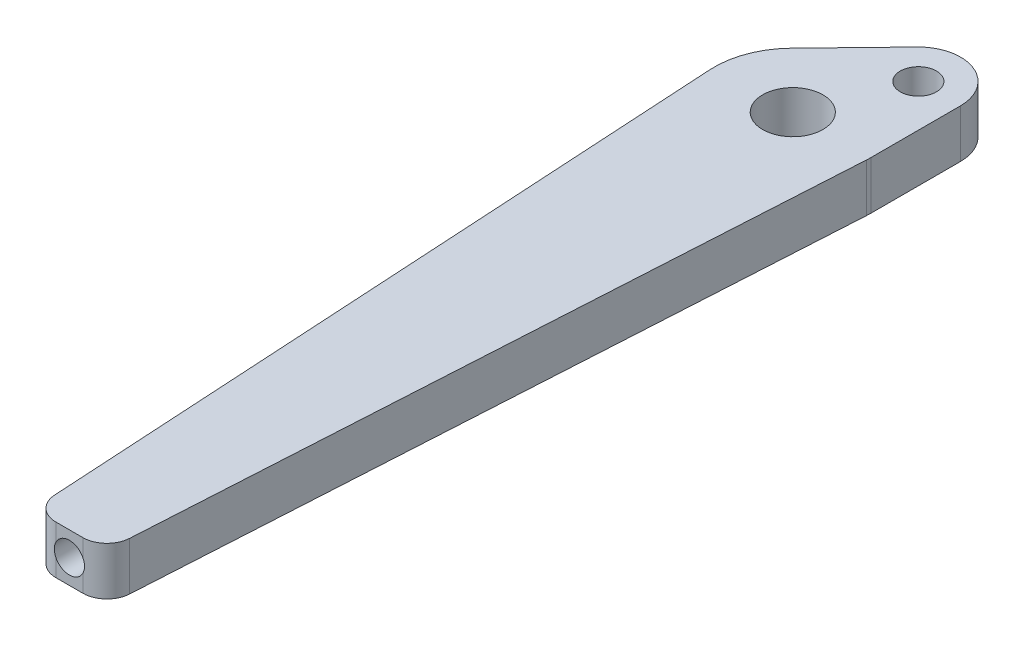
ISO-10303-21;
HEADER;
FILE_DESCRIPTION(('STEP AP214'),'2;1');
FILE_NAME('part.step','',(''),(''),'','','');
FILE_SCHEMA(('AUTOMOTIVE_DESIGN { 1 0 10303 214 1 1 1 1 }'));
ENDSEC;
DATA;
#1=APPLICATION_CONTEXT('core data for automotive mechanical design processes');
#2=APPLICATION_PROTOCOL_DEFINITION('international standard','automotive_design',2000,#1);
#3=PRODUCT_CONTEXT('',#1,'mechanical');
#4=PRODUCT('Part','Part','',(#3));
#5=PRODUCT_RELATED_PRODUCT_CATEGORY('part','',(#4));
#6=PRODUCT_DEFINITION_FORMATION('','',#4);
#7=PRODUCT_DEFINITION_CONTEXT('part definition',#1,'design');
#8=PRODUCT_DEFINITION('design','',#6,#7);
#9=PRODUCT_DEFINITION_SHAPE('','',#8);
#10=(LENGTH_UNIT() NAMED_UNIT(*) SI_UNIT(.MILLI.,.METRE.));
#11=(NAMED_UNIT(*) PLANE_ANGLE_UNIT() SI_UNIT($,.RADIAN.));
#12=(NAMED_UNIT(*) SI_UNIT($,.STERADIAN.) SOLID_ANGLE_UNIT());
#13=UNCERTAINTY_MEASURE_WITH_UNIT(LENGTH_MEASURE(1.E-05),#10,'distance_accuracy_value','');
#14=(GEOMETRIC_REPRESENTATION_CONTEXT(3) GLOBAL_UNCERTAINTY_ASSIGNED_CONTEXT((#13)) GLOBAL_UNIT_ASSIGNED_CONTEXT((#10,
#11,#12)) REPRESENTATION_CONTEXT('',''));
#15=CARTESIAN_POINT('',(0.,0.,0.));
#16=DIRECTION('',(0.,0.,1.));
#17=DIRECTION('',(1.,0.,0.));
#18=AXIS2_PLACEMENT_3D('',#15,#16,#17);
#19=CARTESIAN_POINT('',(-3.80999999999999,5.08,76.2));
#20=DIRECTION('',(0.,0.,-1.));
#21=DIRECTION('',(-1.,0.,0.));
#22=AXIS2_PLACEMENT_3D('',#19,#20,#21);
#23=PLANE('',#22);
#24=DIRECTION('',(1.,0.,0.));
#25=VECTOR('',#24,1.);
#26=CARTESIAN_POINT('',(-3.80999999999999,5.08,76.2));
#27=LINE('',#26,#25);
#28=CARTESIAN_POINT('',(-1.41429209457838,5.08,76.2));
#29=VERTEX_POINT('',#28);
#30=CARTESIAN_POINT('',(1.41429209457839,5.08,76.2));
#31=VERTEX_POINT('',#30);
#32=EDGE_CURVE('E170',#29,#31,#27,.T.);
#33=ORIENTED_EDGE('',*,*,#32,.F.);
#34=DIRECTION('',(0.,-1.,0.));
#35=VECTOR('',#34,1.);
#36=CARTESIAN_POINT('',(-1.41429209457838,5.08,76.2));
#37=LINE('',#36,#35);
#38=CARTESIAN_POINT('',(-1.41429209457838,3.26106457492591,76.2));
#39=VERTEX_POINT('',#38);
#40=EDGE_CURVE('E222',#29,#39,#37,.T.);
#41=ORIENTED_EDGE('',*,*,#40,.T.);
#42=CARTESIAN_POINT('',(0.,2.54,76.2));
#43=DIRECTION('',(0.,0.,1.));
#44=DIRECTION('',(1.,0.,0.));
#45=AXIS2_PLACEMENT_3D('',#42,#43,#44);
#46=CIRCLE('',#45,1.5875);
#47=CARTESIAN_POINT('',(1.41429209457839,3.26106457492591,76.2));
#48=VERTEX_POINT('',#47);
#49=EDGE_CURVE('E146',#48,#39,#46,.T.);
#50=ORIENTED_EDGE('',*,*,#49,.F.);
#51=DIRECTION('',(0.,-1.,0.));
#52=VECTOR('',#51,1.);
#53=CARTESIAN_POINT('',(1.41429209457839,5.08,76.2));
#54=LINE('',#53,#52);
#55=EDGE_CURVE('E216',#48,#31,#54,.F.);
#56=ORIENTED_EDGE('',*,*,#55,.T.);
#57=EDGE_LOOP('',(#33,#41,#50,#56));
#58=FACE_BOUND('',#57,.T.);
#59=ADVANCED_FACE('F42',(#58),#23,.F.);
#60=CARTESIAN_POINT('',(0.,5.08,0.));
#61=DIRECTION('',(0.,1.,0.));
#62=DIRECTION('',(0.,0.,1.));
#63=AXIS2_PLACEMENT_3D('',#60,#61,#62);
#64=PLANE('',#63);
#65=CARTESIAN_POINT('',(0.,5.08,0.));
#66=DIRECTION('',(0.,1.,0.));
#67=DIRECTION('',(0.,0.,1.));
#68=AXIS2_PLACEMENT_3D('',#65,#66,#67);
#69=CIRCLE('',#68,3.175);
#70=CARTESIAN_POINT('',(0.,5.08,3.175));
#71=VERTEX_POINT('',#70);
#72=EDGE_CURVE('E158',#71,#71,#69,.T.);
#73=ORIENTED_EDGE('',*,*,#72,.F.);
#74=EDGE_LOOP('',(#73));
#75=FACE_BOUND('',#74,.T.);
#76=DIRECTION('',(0.0584187249361711,0.,0.998292167943249));
#77=VECTOR('',#76,1.);
#78=CARTESIAN_POINT('',(-8.24090184637152,5.08,0.482246574348092));
#79=LINE('',#78,#77);
#80=CARTESIAN_POINT('',(-8.24090184637152,5.08,0.482246574348092));
#81=VERTEX_POINT('',#80);
#82=CARTESIAN_POINT('',(-3.94995420115423,5.08,73.8083835613379));
#83=VERTEX_POINT('',#82);
#84=EDGE_CURVE('E167',#81,#83,#79,.T.);
#85=ORIENTED_EDGE('',*,*,#84,.T.);
#86=CARTESIAN_POINT('',(-1.41429209457838,5.08,73.66));
#87=DIRECTION('',(0.,1.,0.));
#88=DIRECTION('',(0.,0.,1.));
#89=AXIS2_PLACEMENT_3D('',#86,#87,#88);
#90=CIRCLE('',#89,2.54);
#91=EDGE_CURVE('E51',#83,#29,#90,.T.);
#92=ORIENTED_EDGE('',*,*,#91,.T.);
#93=ORIENTED_EDGE('',*,*,#32,.T.);
#94=CARTESIAN_POINT('',(1.41429209457839,5.08,73.66));
#95=DIRECTION('',(0.,1.,0.));
#96=DIRECTION('',(0.,0.,1.));
#97=AXIS2_PLACEMENT_3D('',#94,#95,#96);
#98=CIRCLE('',#97,2.54);
#99=CARTESIAN_POINT('',(3.94995420115425,5.08,73.8083835613379));
#100=VERTEX_POINT('',#99);
#101=EDGE_CURVE('E58',#31,#100,#98,.T.);
#102=ORIENTED_EDGE('',*,*,#101,.T.);
#103=DIRECTION('',(0.0584187249361708,0.,-0.998292167943249));
#104=VECTOR('',#103,1.);
#105=CARTESIAN_POINT('',(8.24090184637152,5.08,0.48224657434809));
#106=LINE('',#105,#104);
#107=CARTESIAN_POINT('',(8.24090184637152,5.08,0.48224657434809));
#108=VERTEX_POINT('',#107);
#109=EDGE_CURVE('E172',#100,#108,#106,.T.);
#110=ORIENTED_EDGE('',*,*,#109,.T.);
#111=CARTESIAN_POINT('',(0.,5.08,0.));
#112=DIRECTION('',(0.,1.,0.));
#113=DIRECTION('',(0.,0.,1.));
#114=AXIS2_PLACEMENT_3D('',#111,#112,#113);
#115=CIRCLE('',#114,8.255);
#116=CARTESIAN_POINT('',(8.255,5.08,0.));
#117=VERTEX_POINT('',#116);
#118=EDGE_CURVE('E174',#108,#117,#115,.T.);
#119=ORIENTED_EDGE('',*,*,#118,.T.);
#120=DIRECTION('',(0.,0.,-1.));
#121=VECTOR('',#120,1.);
#122=CARTESIAN_POINT('',(8.255,5.08,-9.41857207861149));
#123=LINE('',#122,#121);
#124=CARTESIAN_POINT('',(8.255,5.08,-9.41857207861149));
#125=VERTEX_POINT('',#124);
#126=EDGE_CURVE('E176',#117,#125,#123,.T.);
#127=ORIENTED_EDGE('',*,*,#126,.T.);
#128=CARTESIAN_POINT('',(3.81,5.08,-9.41857207861149));
#129=DIRECTION('',(0.,1.,0.));
#130=DIRECTION('',(0.,0.,1.));
#131=AXIS2_PLACEMENT_3D('',#128,#129,#130);
#132=CIRCLE('',#131,4.445);
#133=CARTESIAN_POINT('',(0.615156250000001,5.08,-12.5090410419059));
#134=VERTEX_POINT('',#133);
#135=EDGE_CURVE('E178',#125,#134,#132,.T.);
#136=ORIENTED_EDGE('',*,*,#135,.T.);
#137=DIRECTION('',(-0.695268608165218,0.,0.71875));
#138=VECTOR('',#137,1.);
#139=CARTESIAN_POINT('',(-5.93328125,5.08,-5.73944236040388));
#140=LINE('',#139,#138);
#141=CARTESIAN_POINT('',(-5.93328125,5.08,-5.73944236040388));
#142=VERTEX_POINT('',#141);
#143=EDGE_CURVE('E180',#134,#142,#140,.T.);
#144=ORIENTED_EDGE('',*,*,#143,.T.);
#145=CARTESIAN_POINT('',(0.,5.08,0.));
#146=DIRECTION('',(0.,1.,0.));
#147=DIRECTION('',(0.,0.,1.));
#148=AXIS2_PLACEMENT_3D('',#145,#146,#147);
#149=CIRCLE('',#148,8.255);
#150=EDGE_CURVE('E164',#142,#81,#149,.T.);
#151=ORIENTED_EDGE('',*,*,#150,.T.);
#152=EDGE_LOOP('',(#85,#92,#93,#102,#110,#119,#127,#136,#144,#151));
#153=FACE_BOUND('',#152,.T.);
#154=CARTESIAN_POINT('',(3.81,5.08,-9.41857207861149));
#155=DIRECTION('',(0.,1.,0.));
#156=DIRECTION('',(0.,0.,1.));
#157=AXIS2_PLACEMENT_3D('',#154,#155,#156);
#158=CIRCLE('',#157,1.905);
#159=CARTESIAN_POINT('',(3.81,5.08,-7.51357207861149));
#160=VERTEX_POINT('',#159);
#161=EDGE_CURVE('E149',#160,#160,#158,.T.);
#162=ORIENTED_EDGE('',*,*,#161,.F.);
#163=EDGE_LOOP('',(#162));
#164=FACE_BOUND('',#163,.T.);
#165=ADVANCED_FACE('F251',(#75,#153,#164),#64,.T.);
#166=CARTESIAN_POINT('',(0.,0.,0.));
#167=DIRECTION('',(0.,1.,0.));
#168=DIRECTION('',(0.,0.,1.));
#169=AXIS2_PLACEMENT_3D('',#166,#167,#168);
#170=PLANE('',#169);
#171=DIRECTION('',(1.,0.,0.));
#172=VECTOR('',#171,1.);
#173=CARTESIAN_POINT('',(-3.80999999999999,0.,76.2));
#174=LINE('',#173,#172);
#175=CARTESIAN_POINT('',(-1.41429209457838,0.,76.2));
#176=VERTEX_POINT('',#175);
#177=CARTESIAN_POINT('',(1.41429209457839,0.,76.2));
#178=VERTEX_POINT('',#177);
#179=EDGE_CURVE('E187',#176,#178,#174,.T.);
#180=ORIENTED_EDGE('',*,*,#179,.F.);
#181=CARTESIAN_POINT('',(-1.41429209457838,0.,73.66));
#182=DIRECTION('',(0.,1.,0.));
#183=DIRECTION('',(0.,0.,1.));
#184=AXIS2_PLACEMENT_3D('',#181,#182,#183);
#185=CIRCLE('',#184,2.54);
#186=CARTESIAN_POINT('',(-3.94995420115423,0.,73.8083835613379));
#187=VERTEX_POINT('',#186);
#188=EDGE_CURVE('E310',#176,#187,#185,.F.);
#189=ORIENTED_EDGE('',*,*,#188,.T.);
#190=DIRECTION('',(0.0584187249361711,0.,0.998292167943249));
#191=VECTOR('',#190,1.);
#192=CARTESIAN_POINT('',(-8.24090184637152,0.,0.482246574348092));
#193=LINE('',#192,#191);
#194=CARTESIAN_POINT('',(-8.24090184637152,0.,0.482246574348092));
#195=VERTEX_POINT('',#194);
#196=EDGE_CURVE('E185',#195,#187,#193,.T.);
#197=ORIENTED_EDGE('',*,*,#196,.F.);
#198=CARTESIAN_POINT('',(0.,0.,0.));
#199=DIRECTION('',(0.,1.,0.));
#200=DIRECTION('',(0.,0.,1.));
#201=AXIS2_PLACEMENT_3D('',#198,#199,#200);
#202=CIRCLE('',#201,8.255);
#203=CARTESIAN_POINT('',(-5.93328125,0.,-5.73944236040388));
#204=VERTEX_POINT('',#203);
#205=EDGE_CURVE('E161',#204,#195,#202,.T.);
#206=ORIENTED_EDGE('',*,*,#205,.F.);
#207=DIRECTION('',(-0.695268608165218,0.,0.71875));
#208=VECTOR('',#207,1.);
#209=CARTESIAN_POINT('',(-5.93328125,0.,-5.73944236040388));
#210=LINE('',#209,#208);
#211=CARTESIAN_POINT('',(0.615156250000001,0.,-12.5090410419059));
#212=VERTEX_POINT('',#211);
#213=EDGE_CURVE('E168',#212,#204,#210,.T.);
#214=ORIENTED_EDGE('',*,*,#213,.F.);
#215=CARTESIAN_POINT('',(3.81,0.,-9.41857207861149));
#216=DIRECTION('',(0.,1.,0.));
#217=DIRECTION('',(0.,0.,1.));
#218=AXIS2_PLACEMENT_3D('',#215,#216,#217);
#219=CIRCLE('',#218,4.445);
#220=CARTESIAN_POINT('',(8.255,0.,-9.41857207861149));
#221=VERTEX_POINT('',#220);
#222=EDGE_CURVE('E196',#221,#212,#219,.T.);
#223=ORIENTED_EDGE('',*,*,#222,.F.);
#224=DIRECTION('',(0.,0.,-1.));
#225=VECTOR('',#224,1.);
#226=CARTESIAN_POINT('',(8.255,0.,-9.41857207861149));
#227=LINE('',#226,#225);
#228=CARTESIAN_POINT('',(8.255,0.,0.));
#229=VERTEX_POINT('',#228);
#230=EDGE_CURVE('E194',#229,#221,#227,.T.);
#231=ORIENTED_EDGE('',*,*,#230,.F.);
#232=CARTESIAN_POINT('',(0.,0.,0.));
#233=DIRECTION('',(0.,1.,0.));
#234=DIRECTION('',(0.,0.,1.));
#235=AXIS2_PLACEMENT_3D('',#232,#233,#234);
#236=CIRCLE('',#235,8.255);
#237=CARTESIAN_POINT('',(8.24090184637152,0.,0.48224657434809));
#238=VERTEX_POINT('',#237);
#239=EDGE_CURVE('E192',#238,#229,#236,.T.);
#240=ORIENTED_EDGE('',*,*,#239,.F.);
#241=DIRECTION('',(0.0584187249361708,0.,-0.998292167943249));
#242=VECTOR('',#241,1.);
#243=CARTESIAN_POINT('',(8.24090184637152,0.,0.48224657434809));
#244=LINE('',#243,#242);
#245=CARTESIAN_POINT('',(3.94995420115425,0.,73.8083835613379));
#246=VERTEX_POINT('',#245);
#247=EDGE_CURVE('E190',#246,#238,#244,.T.);
#248=ORIENTED_EDGE('',*,*,#247,.F.);
#249=CARTESIAN_POINT('',(1.41429209457839,0.,73.66));
#250=DIRECTION('',(0.,1.,0.));
#251=DIRECTION('',(0.,0.,1.));
#252=AXIS2_PLACEMENT_3D('',#249,#250,#251);
#253=CIRCLE('',#252,2.54);
#254=EDGE_CURVE('E309',#246,#178,#253,.F.);
#255=ORIENTED_EDGE('',*,*,#254,.T.);
#256=EDGE_LOOP('',(#180,#189,#197,#206,#214,#223,#231,#240,#248,#255));
#257=FACE_BOUND('',#256,.T.);
#258=CARTESIAN_POINT('',(0.,0.,0.));
#259=DIRECTION('',(0.,1.,0.));
#260=DIRECTION('',(0.,0.,1.));
#261=AXIS2_PLACEMENT_3D('',#258,#259,#260);
#262=CIRCLE('',#261,3.175);
#263=CARTESIAN_POINT('',(0.,0.,3.175));
#264=VERTEX_POINT('',#263);
#265=EDGE_CURVE('E156',#264,#264,#262,.T.);
#266=ORIENTED_EDGE('',*,*,#265,.T.);
#267=EDGE_LOOP('',(#266));
#268=FACE_BOUND('',#267,.T.);
#269=CARTESIAN_POINT('',(3.81,0.,-9.41857207861149));
#270=DIRECTION('',(0.,1.,0.));
#271=DIRECTION('',(0.,0.,1.));
#272=AXIS2_PLACEMENT_3D('',#269,#270,#271);
#273=CIRCLE('',#272,1.905);
#274=CARTESIAN_POINT('',(3.81,0.,-7.51357207861149));
#275=VERTEX_POINT('',#274);
#276=EDGE_CURVE('E145',#275,#275,#273,.T.);
#277=ORIENTED_EDGE('',*,*,#276,.T.);
#278=EDGE_LOOP('',(#277));
#279=FACE_BOUND('',#278,.T.);
#280=ADVANCED_FACE('F254',(#257,#268,#279),#170,.F.);
#281=CARTESIAN_POINT('',(0.,5.08,0.));
#282=DIRECTION('',(0.,-1.,0.));
#283=DIRECTION('',(0.,0.,-1.));
#284=AXIS2_PLACEMENT_3D('',#281,#282,#283);
#285=CYLINDRICAL_SURFACE('',#284,8.255);
#286=ORIENTED_EDGE('',*,*,#205,.T.);
#287=DIRECTION('',(0.,-1.,0.));
#288=VECTOR('',#287,1.);
#289=CARTESIAN_POINT('',(-8.24090184637152,5.08,0.482246574348092));
#290=LINE('',#289,#288);
#291=EDGE_CURVE('E213',#81,#195,#290,.T.);
#292=ORIENTED_EDGE('',*,*,#291,.F.);
#293=ORIENTED_EDGE('',*,*,#150,.F.);
#294=DIRECTION('',(0.,-1.,0.));
#295=VECTOR('',#294,1.);
#296=CARTESIAN_POINT('',(-5.93328125,5.08,-5.73944236040388));
#297=LINE('',#296,#295);
#298=EDGE_CURVE('E182',#142,#204,#297,.T.);
#299=ORIENTED_EDGE('',*,*,#298,.T.);
#300=EDGE_LOOP('',(#286,#292,#293,#299));
#301=FACE_BOUND('',#300,.T.);
#302=ADVANCED_FACE('F258',(#301),#285,.T.);
#303=CARTESIAN_POINT('',(-8.24090184637152,5.08,0.482246574348092));
#304=DIRECTION('',(0.998292167943249,0.,-0.0584187249361711));
#305=DIRECTION('',(-0.0584187249361711,0.,-0.998292167943249));
#306=AXIS2_PLACEMENT_3D('',#303,#304,#305);
#307=PLANE('',#306);
#308=ORIENTED_EDGE('',*,*,#196,.T.);
#309=DIRECTION('',(0.,-1.,0.));
#310=VECTOR('',#309,1.);
#311=CARTESIAN_POINT('',(-3.94995420115423,5.08,73.8083835613379));
#312=LINE('',#311,#310);
#313=EDGE_CURVE('E66',#187,#83,#312,.F.);
#314=ORIENTED_EDGE('',*,*,#313,.T.);
#315=ORIENTED_EDGE('',*,*,#84,.F.);
#316=ORIENTED_EDGE('',*,*,#291,.T.);
#317=EDGE_LOOP('',(#308,#314,#315,#316));
#318=FACE_BOUND('',#317,.T.);
#319=ADVANCED_FACE('F282',(#318),#307,.F.);
#320=CARTESIAN_POINT('',(-1.41429209457838,1.81893542507409,76.2));
#321=VERTEX_POINT('',#320);
#322=CARTESIAN_POINT('',(1.41429209457839,1.81893542507409,76.2));
#323=VERTEX_POINT('',#322);
#324=EDGE_CURVE('E152',#321,#323,#46,.T.);
#325=ORIENTED_EDGE('',*,*,#324,.F.);
#326=DIRECTION('',(0.,-1.,0.));
#327=VECTOR('',#326,1.);
#328=CARTESIAN_POINT('',(-1.41429209457838,5.08,76.2));
#329=LINE('',#328,#327);
#330=EDGE_CURVE('E220',#321,#176,#329,.T.);
#331=ORIENTED_EDGE('',*,*,#330,.T.);
#332=ORIENTED_EDGE('',*,*,#179,.T.);
#333=DIRECTION('',(0.,-1.,0.));
#334=VECTOR('',#333,1.);
#335=CARTESIAN_POINT('',(1.41429209457839,5.08,76.2));
#336=LINE('',#335,#334);
#337=EDGE_CURVE('E218',#178,#323,#336,.F.);
#338=ORIENTED_EDGE('',*,*,#337,.T.);
#339=EDGE_LOOP('',(#325,#331,#332,#338));
#340=FACE_BOUND('',#339,.T.);
#341=ADVANCED_FACE('F278',(#340),#23,.F.);
#342=CARTESIAN_POINT('',(8.24090184637152,5.08,0.48224657434809));
#343=DIRECTION('',(-0.998292167943249,0.,-0.0584187249361708));
#344=DIRECTION('',(-0.0584187249361708,0.,0.998292167943249));
#345=AXIS2_PLACEMENT_3D('',#342,#343,#344);
#346=PLANE('',#345);
#347=ORIENTED_EDGE('',*,*,#109,.F.);
#348=DIRECTION('',(0.,-1.,0.));
#349=VECTOR('',#348,1.);
#350=CARTESIAN_POINT('',(3.94995420115424,5.08,73.8083835613379));
#351=LINE('',#350,#349);
#352=EDGE_CURVE('E11',#100,#246,#351,.T.);
#353=ORIENTED_EDGE('',*,*,#352,.T.);
#354=ORIENTED_EDGE('',*,*,#247,.T.);
#355=DIRECTION('',(0.,-1.,0.));
#356=VECTOR('',#355,1.);
#357=CARTESIAN_POINT('',(8.24090184637152,5.08,0.48224657434809));
#358=LINE('',#357,#356);
#359=EDGE_CURVE('E210',#108,#238,#358,.T.);
#360=ORIENTED_EDGE('',*,*,#359,.F.);
#361=EDGE_LOOP('',(#347,#353,#354,#360));
#362=FACE_BOUND('',#361,.T.);
#363=ADVANCED_FACE('F274',(#362),#346,.F.);
#364=CARTESIAN_POINT('',(0.,5.08,0.));
#365=DIRECTION('',(0.,-1.,0.));
#366=DIRECTION('',(0.,0.,-1.));
#367=AXIS2_PLACEMENT_3D('',#364,#365,#366);
#368=CYLINDRICAL_SURFACE('',#367,8.255);
#369=ORIENTED_EDGE('',*,*,#239,.T.);
#370=DIRECTION('',(0.,-1.,0.));
#371=VECTOR('',#370,1.);
#372=CARTESIAN_POINT('',(8.255,5.08,0.));
#373=LINE('',#372,#371);
#374=EDGE_CURVE('E207',#117,#229,#373,.T.);
#375=ORIENTED_EDGE('',*,*,#374,.F.);
#376=ORIENTED_EDGE('',*,*,#118,.F.);
#377=ORIENTED_EDGE('',*,*,#359,.T.);
#378=EDGE_LOOP('',(#369,#375,#376,#377));
#379=FACE_BOUND('',#378,.T.);
#380=ADVANCED_FACE('F270',(#379),#368,.T.);
#381=CARTESIAN_POINT('',(8.255,5.08,-9.41857207861149));
#382=DIRECTION('',(-1.,0.,0.));
#383=DIRECTION('',(0.,0.,1.));
#384=AXIS2_PLACEMENT_3D('',#381,#382,#383);
#385=PLANE('',#384);
#386=ORIENTED_EDGE('',*,*,#230,.T.);
#387=DIRECTION('',(0.,-1.,0.));
#388=VECTOR('',#387,1.);
#389=CARTESIAN_POINT('',(8.255,5.08,-9.41857207861149));
#390=LINE('',#389,#388);
#391=EDGE_CURVE('E204',#125,#221,#390,.T.);
#392=ORIENTED_EDGE('',*,*,#391,.F.);
#393=ORIENTED_EDGE('',*,*,#126,.F.);
#394=ORIENTED_EDGE('',*,*,#374,.T.);
#395=EDGE_LOOP('',(#386,#392,#393,#394));
#396=FACE_BOUND('',#395,.T.);
#397=ADVANCED_FACE('F266',(#396),#385,.F.);
#398=CARTESIAN_POINT('',(3.81,5.08,-9.41857207861149));
#399=DIRECTION('',(0.,-1.,0.));
#400=DIRECTION('',(0.,0.,-1.));
#401=AXIS2_PLACEMENT_3D('',#398,#399,#400);
#402=CYLINDRICAL_SURFACE('',#401,4.445);
#403=ORIENTED_EDGE('',*,*,#222,.T.);
#404=DIRECTION('',(0.,-1.,0.));
#405=VECTOR('',#404,1.);
#406=CARTESIAN_POINT('',(0.615156250000001,5.08,-12.5090410419059));
#407=LINE('',#406,#405);
#408=EDGE_CURVE('E201',#134,#212,#407,.T.);
#409=ORIENTED_EDGE('',*,*,#408,.F.);
#410=ORIENTED_EDGE('',*,*,#135,.F.);
#411=ORIENTED_EDGE('',*,*,#391,.T.);
#412=EDGE_LOOP('',(#403,#409,#410,#411));
#413=FACE_BOUND('',#412,.T.);
#414=ADVANCED_FACE('F262',(#413),#402,.T.);
#415=CARTESIAN_POINT('',(-5.93328125,5.08,-5.73944236040388));
#416=DIRECTION('',(0.71875,0.,0.695268608165218));
#417=DIRECTION('',(0.695268608165218,0.,-0.71875));
#418=AXIS2_PLACEMENT_3D('',#415,#416,#417);
#419=PLANE('',#418);
#420=ORIENTED_EDGE('',*,*,#213,.T.);
#421=ORIENTED_EDGE('',*,*,#298,.F.);
#422=ORIENTED_EDGE('',*,*,#143,.F.);
#423=ORIENTED_EDGE('',*,*,#408,.T.);
#424=EDGE_LOOP('',(#420,#421,#422,#423));
#425=FACE_BOUND('',#424,.T.);
#426=ADVANCED_FACE('F249',(#425),#419,.F.);
#427=CARTESIAN_POINT('',(0.,5.08,0.));
#428=DIRECTION('',(0.,-1.,0.));
#429=DIRECTION('',(0.,0.,-1.));
#430=AXIS2_PLACEMENT_3D('',#427,#428,#429);
#431=CYLINDRICAL_SURFACE('',#430,3.175);
#432=ORIENTED_EDGE('',*,*,#72,.T.);
#433=EDGE_LOOP('',(#432));
#434=FACE_BOUND('',#433,.T.);
#435=ORIENTED_EDGE('',*,*,#265,.F.);
#436=EDGE_LOOP('',(#435));
#437=FACE_BOUND('',#436,.T.);
#438=ADVANCED_FACE('F245',(#434,#437),#431,.F.);
#439=CARTESIAN_POINT('',(3.81,5.08,-9.41857207861149));
#440=DIRECTION('',(0.,-1.,0.));
#441=DIRECTION('',(0.,0.,-1.));
#442=AXIS2_PLACEMENT_3D('',#439,#440,#441);
#443=CYLINDRICAL_SURFACE('',#442,1.905);
#444=ORIENTED_EDGE('',*,*,#161,.T.);
#445=EDGE_LOOP('',(#444));
#446=FACE_BOUND('',#445,.T.);
#447=ORIENTED_EDGE('',*,*,#276,.F.);
#448=EDGE_LOOP('',(#447));
#449=FACE_BOUND('',#448,.T.);
#450=ADVANCED_FACE('F139',(#446,#449),#443,.F.);
#451=CARTESIAN_POINT('',(0.,2.54,63.5));
#452=DIRECTION('',(0.,0.,1.));
#453=DIRECTION('',(1.,0.,0.));
#454=AXIS2_PLACEMENT_3D('',#451,#452,#453);
#455=CONICAL_SURFACE('',#454,1.5875,1.02974425867665);
#456=CARTESIAN_POINT('',(0.,2.54,62.5461337672937));
#457=VERTEX_POINT('',#456);
#458=VERTEX_LOOP('',#457);
#459=FACE_BOUND('',#458,.T.);
#460=CARTESIAN_POINT('',(0.,2.54,63.5));
#461=DIRECTION('',(0.,0.,1.));
#462=DIRECTION('',(1.,0.,0.));
#463=AXIS2_PLACEMENT_3D('',#460,#461,#462);
#464=CIRCLE('',#463,1.5875);
#465=CARTESIAN_POINT('',(1.58750000000001,2.54,63.5));
#466=VERTEX_POINT('',#465);
#467=EDGE_CURVE('E143',#466,#466,#464,.T.);
#468=ORIENTED_EDGE('',*,*,#467,.T.);
#469=EDGE_LOOP('',(#468));
#470=FACE_BOUND('',#469,.T.);
#471=ADVANCED_FACE('F135',(#459,#470),#455,.F.);
#472=CARTESIAN_POINT('',(0.,2.54,76.2));
#473=DIRECTION('',(0.,0.,1.));
#474=DIRECTION('',(1.,0.,0.));
#475=AXIS2_PLACEMENT_3D('',#472,#473,#474);
#476=CYLINDRICAL_SURFACE('',#475,1.5875);
#477=ORIENTED_EDGE('',*,*,#467,.F.);
#478=EDGE_LOOP('',(#477));
#479=FACE_BOUND('',#478,.T.);
#480=ORIENTED_EDGE('',*,*,#49,.T.);
#481=CARTESIAN_POINT('',(-1.41429209457838,3.26106457492591,76.2));
#482=CARTESIAN_POINT('',(-1.43457191265879,3.22128694997854,76.1999958943921));
#483=CARTESIAN_POINT('',(-1.45316275244956,3.18067419782652,76.1997578212476));
#484=CARTESIAN_POINT('',(-1.48685902849042,3.09803215795095,76.1990197547757));
#485=CARTESIAN_POINT('',(-1.50196463929351,3.05600294128999,76.1985197745695));
#486=CARTESIAN_POINT('',(-1.5418441161221,2.92832880002766,76.1969379427408));
#487=CARTESIAN_POINT('',(-1.5612593630396,2.84094255804846,76.1957726003133));
#488=CARTESIAN_POINT('',(-1.58515863882838,2.6641207100094,76.1942749013864));
#489=CARTESIAN_POINT('',(-1.58963063410568,2.57468351066366,76.1939432162729));
#490=CARTESIAN_POINT('',(-1.58349879826558,2.39634578115808,76.1943591205826));
#491=CARTESIAN_POINT('',(-1.5729025523589,2.30744500358717,76.1951061669854));
#492=CARTESIAN_POINT('',(-1.54061167826727,2.15047790474295,76.1968980586873));
#493=CARTESIAN_POINT('',(-1.52160471173805,2.08184374969158,76.1978517426866));
#494=CARTESIAN_POINT('',(-1.47459848468621,1.94773185878658,76.1993821379988));
#495=CARTESIAN_POINT('',(-1.44660011407993,1.88225381129727,76.1999588866014));
#496=CARTESIAN_POINT('',(-1.41429209457837,1.81893542507409,76.2));
#497=B_SPLINE_CURVE_WITH_KNOTS('',3,(#481,#482,#483,#484,#485,#486,#487,#488,#489,#490,#491,
#492,#493,#494,#495,#496),.UNSPECIFIED.,.F.,.F.,(4,2,2,2,2,2,2,4),(0.,0.133861573830956,
0.267716441929052,0.534911689057742,0.802322053037823,1.06959785280076,1.28265086886449,
1.49568280468789),.UNSPECIFIED.);
#498=EDGE_CURVE('E232',#39,#321,#497,.T.);
#499=ORIENTED_EDGE('',*,*,#498,.T.);
#500=ORIENTED_EDGE('',*,*,#324,.T.);
#501=CARTESIAN_POINT('',(1.41429209457839,1.81893542507409,76.2));
#502=CARTESIAN_POINT('',(1.43457191265881,1.85871305002146,76.1999958943921));
#503=CARTESIAN_POINT('',(1.45316275244958,1.89932580217348,76.1997578212476));
#504=CARTESIAN_POINT('',(1.48685902849044,1.98196784204906,76.1990197547757));
#505=CARTESIAN_POINT('',(1.50196463929352,2.02399705871002,76.1985197745695));
#506=CARTESIAN_POINT('',(1.54184411612212,2.15167119997234,76.1969379427408));
#507=CARTESIAN_POINT('',(1.56125936303961,2.23905744195155,76.1957726003133));
#508=CARTESIAN_POINT('',(1.5851586388284,2.4158792899906,76.1942749013864));
#509=CARTESIAN_POINT('',(1.5896306341057,2.50531648933634,76.1939432162729));
#510=CARTESIAN_POINT('',(1.5834987982656,2.68365421884193,76.1943591205826));
#511=CARTESIAN_POINT('',(1.57290255235892,2.77255499641283,76.1951061669854));
#512=CARTESIAN_POINT('',(1.54061167826729,2.92952209525705,76.1968980586873));
#513=CARTESIAN_POINT('',(1.52160471173807,2.99815625030843,76.1978517426866));
#514=CARTESIAN_POINT('',(1.47459848468623,3.13226814121342,76.1993821379988));
#515=CARTESIAN_POINT('',(1.44660011407995,3.19774618870272,76.1999588866014));
#516=CARTESIAN_POINT('',(1.41429209457839,3.26106457492591,76.2));
#517=B_SPLINE_CURVE_WITH_KNOTS('',3,(#501,#502,#503,#504,#505,#506,#507,#508,#509,#510,#511,
#512,#513,#514,#515,#516),.UNSPECIFIED.,.F.,.F.,(4,2,2,2,2,2,2,4),(0.,0.133861573830956,
0.267716441929052,0.534911689057743,0.802322053037824,1.06959785280076,1.28265086886449,
1.49568280468788),.UNSPECIFIED.);
#518=EDGE_CURVE('E225',#323,#48,#517,.T.);
#519=ORIENTED_EDGE('',*,*,#518,.T.);
#520=EDGE_LOOP('',(#480,#499,#500,#519));
#521=FACE_BOUND('',#520,.T.);
#522=ADVANCED_FACE('F138',(#479,#521),#476,.F.);
#523=CARTESIAN_POINT('',(-1.41429209457838,5.08,73.66));
#524=DIRECTION('',(0.,-1.,0.));
#525=DIRECTION('',(0.,0.,-1.));
#526=AXIS2_PLACEMENT_3D('',#523,#524,#525);
#527=CYLINDRICAL_SURFACE('',#526,2.54);
#528=ORIENTED_EDGE('',*,*,#91,.F.);
#529=ORIENTED_EDGE('',*,*,#313,.F.);
#530=ORIENTED_EDGE('',*,*,#188,.F.);
#531=ORIENTED_EDGE('',*,*,#330,.F.);
#532=ORIENTED_EDGE('',*,*,#498,.F.);
#533=ORIENTED_EDGE('',*,*,#40,.F.);
#534=EDGE_LOOP('',(#528,#529,#530,#531,#532,#533));
#535=FACE_BOUND('',#534,.T.);
#536=ADVANCED_FACE('F240',(#535),#527,.T.);
#537=CARTESIAN_POINT('',(1.41429209457839,5.08,73.66));
#538=DIRECTION('',(0.,-1.,0.));
#539=DIRECTION('',(0.,0.,-1.));
#540=AXIS2_PLACEMENT_3D('',#537,#538,#539);
#541=CYLINDRICAL_SURFACE('',#540,2.54);
#542=ORIENTED_EDGE('',*,*,#518,.F.);
#543=ORIENTED_EDGE('',*,*,#337,.F.);
#544=ORIENTED_EDGE('',*,*,#254,.F.);
#545=ORIENTED_EDGE('',*,*,#352,.F.);
#546=ORIENTED_EDGE('',*,*,#101,.F.);
#547=ORIENTED_EDGE('',*,*,#55,.F.);
#548=EDGE_LOOP('',(#542,#543,#544,#545,#546,#547));
#549=FACE_BOUND('',#548,.T.);
#550=ADVANCED_FACE('F44',(#549),#541,.T.);
#551=CLOSED_SHELL('',(#59,#165,#280,#302,#319,#341,#363,#380,#397,#414,#426,#438,#450,#471,#522,
#536,#550));
#552=MANIFOLD_SOLID_BREP('B2',#551);
#553=ADVANCED_BREP_SHAPE_REPRESENTATION('',(#18,#552),#14);
#554=SHAPE_DEFINITION_REPRESENTATION(#9,#553);
ENDSEC;
END-ISO-10303-21;
